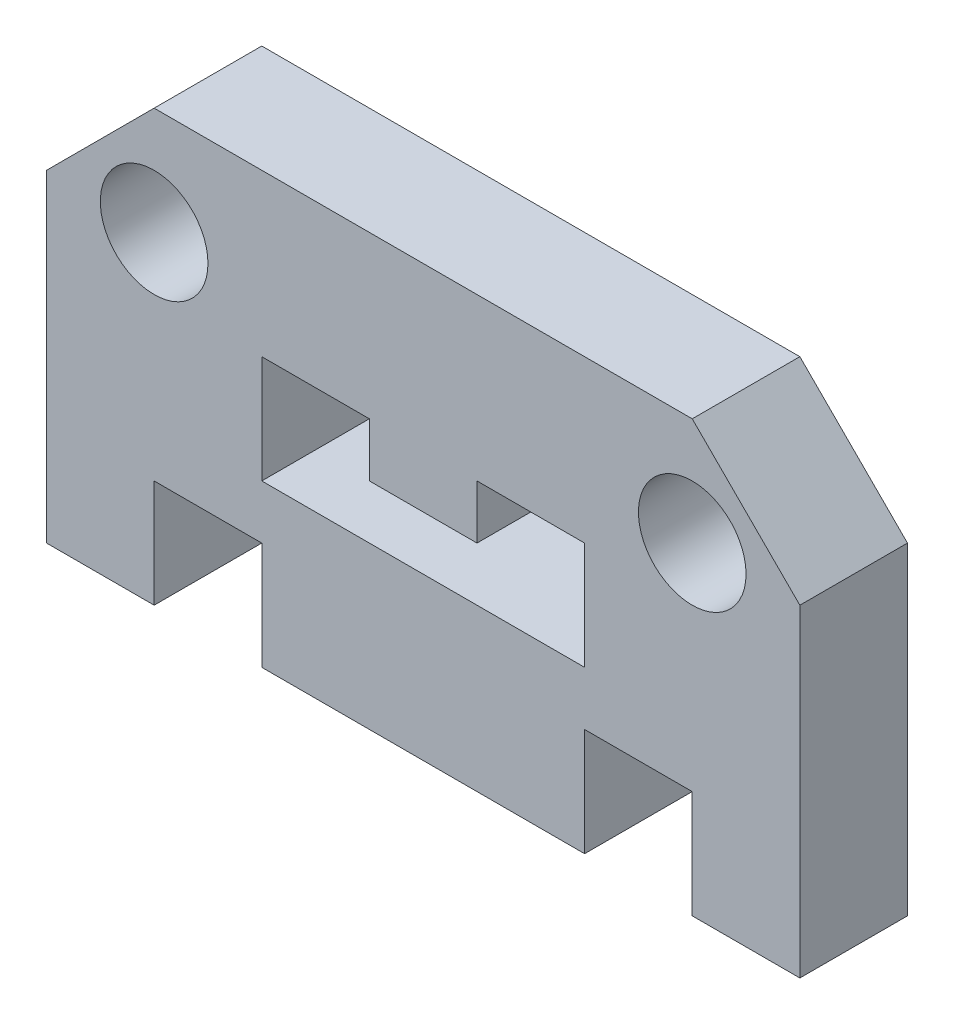
ISO-10303-21;
HEADER;
FILE_DESCRIPTION(('STEP AP214'),'2;1');
FILE_NAME('part.step','',(''),(''),'','','');
FILE_SCHEMA(('AUTOMOTIVE_DESIGN { 1 0 10303 214 1 1 1 1 }'));
ENDSEC;
DATA;
#1=APPLICATION_CONTEXT('core data for automotive mechanical design processes');
#2=APPLICATION_PROTOCOL_DEFINITION('international standard','automotive_design',2000,#1);
#3=PRODUCT_CONTEXT('',#1,'mechanical');
#4=PRODUCT('Part','Part','',(#3));
#5=PRODUCT_RELATED_PRODUCT_CATEGORY('part','',(#4));
#6=PRODUCT_DEFINITION_FORMATION('','',#4);
#7=PRODUCT_DEFINITION_CONTEXT('part definition',#1,'design');
#8=PRODUCT_DEFINITION('design','',#6,#7);
#9=PRODUCT_DEFINITION_SHAPE('','',#8);
#10=(LENGTH_UNIT() NAMED_UNIT(*) SI_UNIT(.MILLI.,.METRE.));
#11=(NAMED_UNIT(*) PLANE_ANGLE_UNIT() SI_UNIT($,.RADIAN.));
#12=(NAMED_UNIT(*) SI_UNIT($,.STERADIAN.) SOLID_ANGLE_UNIT());
#13=UNCERTAINTY_MEASURE_WITH_UNIT(LENGTH_MEASURE(1.E-05),#10,'distance_accuracy_value','');
#14=(GEOMETRIC_REPRESENTATION_CONTEXT(3) GLOBAL_UNCERTAINTY_ASSIGNED_CONTEXT((#13)) GLOBAL_UNIT_ASSIGNED_CONTEXT((#10,
#11,#12)) REPRESENTATION_CONTEXT('',''));
#15=CARTESIAN_POINT('',(0.,0.,0.));
#16=DIRECTION('',(0.,0.,1.));
#17=DIRECTION('',(1.,0.,0.));
#18=AXIS2_PLACEMENT_3D('',#15,#16,#17);
#19=CARTESIAN_POINT('',(0.,0.,10.));
#20=DIRECTION('',(0.,0.,-1.));
#21=DIRECTION('',(-1.,0.,0.));
#22=AXIS2_PLACEMENT_3D('',#19,#20,#21);
#23=PLANE('',#22);
#24=CARTESIAN_POINT('',(25.,30.,10.));
#25=DIRECTION('',(0.,0.,1.));
#26=DIRECTION('',(1.,0.,0.));
#27=AXIS2_PLACEMENT_3D('',#24,#25,#26);
#28=CIRCLE('',#27,5.);
#29=CARTESIAN_POINT('',(30.,30.,10.));
#30=VERTEX_POINT('',#29);
#31=EDGE_CURVE('E251',#30,#30,#28,.T.);
#32=ORIENTED_EDGE('',*,*,#31,.F.);
#33=EDGE_LOOP('',(#32));
#34=FACE_BOUND('',#33,.T.);
#35=CARTESIAN_POINT('',(-25.,30.,10.));
#36=DIRECTION('',(0.,0.,1.));
#37=DIRECTION('',(1.,0.,0.));
#38=AXIS2_PLACEMENT_3D('',#35,#36,#37);
#39=CIRCLE('',#38,5.);
#40=CARTESIAN_POINT('',(-20.,30.,10.));
#41=VERTEX_POINT('',#40);
#42=EDGE_CURVE('E257',#41,#41,#39,.T.);
#43=ORIENTED_EDGE('',*,*,#42,.F.);
#44=EDGE_LOOP('',(#43));
#45=FACE_BOUND('',#44,.T.);
#46=DIRECTION('',(1.,0.,0.));
#47=VECTOR('',#46,1.);
#48=CARTESIAN_POINT('',(25.,0.,10.));
#49=LINE('',#48,#47);
#50=CARTESIAN_POINT('',(25.,0.,10.));
#51=VERTEX_POINT('',#50);
#52=CARTESIAN_POINT('',(35.,0.,10.));
#53=VERTEX_POINT('',#52);
#54=EDGE_CURVE('E263',#51,#53,#49,.T.);
#55=ORIENTED_EDGE('',*,*,#54,.T.);
#56=DIRECTION('',(0.,1.,0.));
#57=VECTOR('',#56,1.);
#58=CARTESIAN_POINT('',(35.,30.,10.));
#59=LINE('',#58,#57);
#60=CARTESIAN_POINT('',(35.,30.,10.));
#61=VERTEX_POINT('',#60);
#62=EDGE_CURVE('E266',#53,#61,#59,.T.);
#63=ORIENTED_EDGE('',*,*,#62,.T.);
#64=DIRECTION('',(-0.707106781186548,0.707106781186547,0.));
#65=VECTOR('',#64,1.);
#66=CARTESIAN_POINT('',(25.,40.,10.));
#67=LINE('',#66,#65);
#68=CARTESIAN_POINT('',(25.,40.,10.));
#69=VERTEX_POINT('',#68);
#70=EDGE_CURVE('E269',#61,#69,#67,.T.);
#71=ORIENTED_EDGE('',*,*,#70,.T.);
#72=DIRECTION('',(-1.,0.,0.));
#73=VECTOR('',#72,1.);
#74=CARTESIAN_POINT('',(-25.,40.,10.));
#75=LINE('',#74,#73);
#76=CARTESIAN_POINT('',(-25.,40.,10.));
#77=VERTEX_POINT('',#76);
#78=EDGE_CURVE('E271',#69,#77,#75,.T.);
#79=ORIENTED_EDGE('',*,*,#78,.T.);
#80=DIRECTION('',(-0.707106781186549,-0.707106781186546,0.));
#81=VECTOR('',#80,1.);
#82=CARTESIAN_POINT('',(-35.,30.,10.));
#83=LINE('',#82,#81);
#84=CARTESIAN_POINT('',(-35.,30.,10.));
#85=VERTEX_POINT('',#84);
#86=EDGE_CURVE('E273',#77,#85,#83,.T.);
#87=ORIENTED_EDGE('',*,*,#86,.T.);
#88=DIRECTION('',(0.,-1.,0.));
#89=VECTOR('',#88,1.);
#90=CARTESIAN_POINT('',(-35.,30.,10.));
#91=LINE('',#90,#89);
#92=CARTESIAN_POINT('',(-35.,0.,10.));
#93=VERTEX_POINT('',#92);
#94=EDGE_CURVE('E275',#85,#93,#91,.T.);
#95=ORIENTED_EDGE('',*,*,#94,.T.);
#96=DIRECTION('',(1.,0.,0.));
#97=VECTOR('',#96,1.);
#98=CARTESIAN_POINT('',(-35.,0.,10.));
#99=LINE('',#98,#97);
#100=CARTESIAN_POINT('',(-25.,0.,10.));
#101=VERTEX_POINT('',#100);
#102=EDGE_CURVE('E277',#93,#101,#99,.T.);
#103=ORIENTED_EDGE('',*,*,#102,.T.);
#104=DIRECTION('',(0.,1.,0.));
#105=VECTOR('',#104,1.);
#106=CARTESIAN_POINT('',(-25.,0.,10.));
#107=LINE('',#106,#105);
#108=CARTESIAN_POINT('',(-25.,10.,10.));
#109=VERTEX_POINT('',#108);
#110=EDGE_CURVE('E279',#101,#109,#107,.T.);
#111=ORIENTED_EDGE('',*,*,#110,.T.);
#112=DIRECTION('',(1.,0.,0.));
#113=VECTOR('',#112,1.);
#114=CARTESIAN_POINT('',(-25.,10.,10.));
#115=LINE('',#114,#113);
#116=CARTESIAN_POINT('',(-15.,10.,10.));
#117=VERTEX_POINT('',#116);
#118=EDGE_CURVE('E281',#109,#117,#115,.T.);
#119=ORIENTED_EDGE('',*,*,#118,.T.);
#120=DIRECTION('',(0.,-1.,0.));
#121=VECTOR('',#120,1.);
#122=CARTESIAN_POINT('',(-15.,10.,10.));
#123=LINE('',#122,#121);
#124=CARTESIAN_POINT('',(-15.,0.,10.));
#125=VERTEX_POINT('',#124);
#126=EDGE_CURVE('E283',#117,#125,#123,.T.);
#127=ORIENTED_EDGE('',*,*,#126,.T.);
#128=DIRECTION('',(1.,0.,0.));
#129=VECTOR('',#128,1.);
#130=CARTESIAN_POINT('',(-15.,0.,10.));
#131=LINE('',#130,#129);
#132=CARTESIAN_POINT('',(15.,0.,10.));
#133=VERTEX_POINT('',#132);
#134=EDGE_CURVE('E285',#125,#133,#131,.T.);
#135=ORIENTED_EDGE('',*,*,#134,.T.);
#136=DIRECTION('',(0.,1.,0.));
#137=VECTOR('',#136,1.);
#138=CARTESIAN_POINT('',(15.,10.,10.));
#139=LINE('',#138,#137);
#140=CARTESIAN_POINT('',(15.,10.,10.));
#141=VERTEX_POINT('',#140);
#142=EDGE_CURVE('E287',#133,#141,#139,.T.);
#143=ORIENTED_EDGE('',*,*,#142,.T.);
#144=DIRECTION('',(1.,0.,0.));
#145=VECTOR('',#144,1.);
#146=CARTESIAN_POINT('',(25.,10.,10.));
#147=LINE('',#146,#145);
#148=CARTESIAN_POINT('',(25.,10.,10.));
#149=VERTEX_POINT('',#148);
#150=EDGE_CURVE('E289',#141,#149,#147,.T.);
#151=ORIENTED_EDGE('',*,*,#150,.T.);
#152=DIRECTION('',(0.,-1.,0.));
#153=VECTOR('',#152,1.);
#154=CARTESIAN_POINT('',(25.,0.,10.));
#155=LINE('',#154,#153);
#156=EDGE_CURVE('E291',#149,#51,#155,.T.);
#157=ORIENTED_EDGE('',*,*,#156,.T.);
#158=EDGE_LOOP('',(#55,#63,#71,#79,#87,#95,#103,#111,#119,#127,#135,#143,#151,#157));
#159=FACE_BOUND('',#158,.T.);
#160=DIRECTION('',(0.,-1.,0.));
#161=VECTOR('',#160,1.);
#162=CARTESIAN_POINT('',(-15.,25.,10.));
#163=LINE('',#162,#161);
#164=CARTESIAN_POINT('',(-15.,25.,10.));
#165=VERTEX_POINT('',#164);
#166=CARTESIAN_POINT('',(-15.,15.,10.));
#167=VERTEX_POINT('',#166);
#168=EDGE_CURVE('E186',#165,#167,#163,.T.);
#169=ORIENTED_EDGE('',*,*,#168,.F.);
#170=DIRECTION('',(-1.,0.,0.));
#171=VECTOR('',#170,1.);
#172=CARTESIAN_POINT('',(-15.,25.,10.));
#173=LINE('',#172,#171);
#174=CARTESIAN_POINT('',(-5.,25.,10.));
#175=VERTEX_POINT('',#174);
#176=EDGE_CURVE('E219',#175,#165,#173,.T.);
#177=ORIENTED_EDGE('',*,*,#176,.F.);
#178=DIRECTION('',(0.,1.,0.));
#179=VECTOR('',#178,1.);
#180=CARTESIAN_POINT('',(-5.,25.,10.));
#181=LINE('',#180,#179);
#182=CARTESIAN_POINT('',(-5.,20.,10.));
#183=VERTEX_POINT('',#182);
#184=EDGE_CURVE('E217',#183,#175,#181,.T.);
#185=ORIENTED_EDGE('',*,*,#184,.F.);
#186=DIRECTION('',(-1.,0.,0.));
#187=VECTOR('',#186,1.);
#188=CARTESIAN_POINT('',(-5.,20.,10.));
#189=LINE('',#188,#187);
#190=CARTESIAN_POINT('',(5.,20.,10.));
#191=VERTEX_POINT('',#190);
#192=EDGE_CURVE('E215',#191,#183,#189,.T.);
#193=ORIENTED_EDGE('',*,*,#192,.F.);
#194=DIRECTION('',(0.,-1.,0.));
#195=VECTOR('',#194,1.);
#196=CARTESIAN_POINT('',(5.,25.,10.));
#197=LINE('',#196,#195);
#198=CARTESIAN_POINT('',(5.,25.,10.));
#199=VERTEX_POINT('',#198);
#200=EDGE_CURVE('E213',#199,#191,#197,.T.);
#201=ORIENTED_EDGE('',*,*,#200,.F.);
#202=DIRECTION('',(-1.,0.,0.));
#203=VECTOR('',#202,1.);
#204=CARTESIAN_POINT('',(15.,25.,10.));
#205=LINE('',#204,#203);
#206=CARTESIAN_POINT('',(15.,25.,10.));
#207=VERTEX_POINT('',#206);
#208=EDGE_CURVE('E209',#207,#199,#205,.T.);
#209=ORIENTED_EDGE('',*,*,#208,.F.);
#210=DIRECTION('',(0.,1.,0.));
#211=VECTOR('',#210,1.);
#212=CARTESIAN_POINT('',(15.,25.,10.));
#213=LINE('',#212,#211);
#214=CARTESIAN_POINT('',(15.,15.,10.));
#215=VERTEX_POINT('',#214);
#216=EDGE_CURVE('E207',#215,#207,#213,.T.);
#217=ORIENTED_EDGE('',*,*,#216,.F.);
#218=DIRECTION('',(1.,0.,0.));
#219=VECTOR('',#218,1.);
#220=CARTESIAN_POINT('',(15.,15.,10.));
#221=LINE('',#220,#219);
#222=EDGE_CURVE('E194',#167,#215,#221,.T.);
#223=ORIENTED_EDGE('',*,*,#222,.F.);
#224=EDGE_LOOP('',(#169,#177,#185,#193,#201,#209,#217,#223));
#225=FACE_BOUND('',#224,.T.);
#226=ADVANCED_FACE('F37',(#34,#45,#159,#225),#23,.F.);
#227=CARTESIAN_POINT('',(0.,0.,0.));
#228=DIRECTION('',(0.,0.,-1.));
#229=DIRECTION('',(-1.,0.,0.));
#230=AXIS2_PLACEMENT_3D('',#227,#228,#229);
#231=PLANE('',#230);
#232=CARTESIAN_POINT('',(-25.,30.,0.));
#233=DIRECTION('',(0.,0.,1.));
#234=DIRECTION('',(1.,0.,0.));
#235=AXIS2_PLACEMENT_3D('',#232,#233,#234);
#236=CIRCLE('',#235,5.);
#237=CARTESIAN_POINT('',(-20.,30.,0.));
#238=VERTEX_POINT('',#237);
#239=EDGE_CURVE('E254',#238,#238,#236,.T.);
#240=ORIENTED_EDGE('',*,*,#239,.T.);
#241=EDGE_LOOP('',(#240));
#242=FACE_BOUND('',#241,.T.);
#243=DIRECTION('',(1.,0.,0.));
#244=VECTOR('',#243,1.);
#245=CARTESIAN_POINT('',(25.,0.,0.));
#246=LINE('',#245,#244);
#247=CARTESIAN_POINT('',(25.,0.,0.));
#248=VERTEX_POINT('',#247);
#249=CARTESIAN_POINT('',(35.,0.,0.));
#250=VERTEX_POINT('',#249);
#251=EDGE_CURVE('E260',#248,#250,#246,.T.);
#252=ORIENTED_EDGE('',*,*,#251,.F.);
#253=DIRECTION('',(0.,-1.,0.));
#254=VECTOR('',#253,1.);
#255=CARTESIAN_POINT('',(25.,0.,0.));
#256=LINE('',#255,#254);
#257=CARTESIAN_POINT('',(25.,10.,0.));
#258=VERTEX_POINT('',#257);
#259=EDGE_CURVE('E267',#258,#248,#256,.T.);
#260=ORIENTED_EDGE('',*,*,#259,.F.);
#261=DIRECTION('',(1.,0.,0.));
#262=VECTOR('',#261,1.);
#263=CARTESIAN_POINT('',(25.,10.,0.));
#264=LINE('',#263,#262);
#265=CARTESIAN_POINT('',(15.,10.,0.));
#266=VERTEX_POINT('',#265);
#267=EDGE_CURVE('E318',#266,#258,#264,.T.);
#268=ORIENTED_EDGE('',*,*,#267,.F.);
#269=DIRECTION('',(0.,1.,0.));
#270=VECTOR('',#269,1.);
#271=CARTESIAN_POINT('',(15.,10.,0.));
#272=LINE('',#271,#270);
#273=CARTESIAN_POINT('',(15.,0.,0.));
#274=VERTEX_POINT('',#273);
#275=EDGE_CURVE('E316',#274,#266,#272,.T.);
#276=ORIENTED_EDGE('',*,*,#275,.F.);
#277=DIRECTION('',(1.,0.,0.));
#278=VECTOR('',#277,1.);
#279=CARTESIAN_POINT('',(-15.,0.,0.));
#280=LINE('',#279,#278);
#281=CARTESIAN_POINT('',(-15.,0.,0.));
#282=VERTEX_POINT('',#281);
#283=EDGE_CURVE('E314',#282,#274,#280,.T.);
#284=ORIENTED_EDGE('',*,*,#283,.F.);
#285=DIRECTION('',(0.,-1.,0.));
#286=VECTOR('',#285,1.);
#287=CARTESIAN_POINT('',(-15.,10.,0.));
#288=LINE('',#287,#286);
#289=CARTESIAN_POINT('',(-15.,10.,0.));
#290=VERTEX_POINT('',#289);
#291=EDGE_CURVE('E312',#290,#282,#288,.T.);
#292=ORIENTED_EDGE('',*,*,#291,.F.);
#293=DIRECTION('',(1.,0.,0.));
#294=VECTOR('',#293,1.);
#295=CARTESIAN_POINT('',(-25.,10.,0.));
#296=LINE('',#295,#294);
#297=CARTESIAN_POINT('',(-25.,10.,0.));
#298=VERTEX_POINT('',#297);
#299=EDGE_CURVE('E310',#298,#290,#296,.T.);
#300=ORIENTED_EDGE('',*,*,#299,.F.);
#301=DIRECTION('',(0.,1.,0.));
#302=VECTOR('',#301,1.);
#303=CARTESIAN_POINT('',(-25.,0.,0.));
#304=LINE('',#303,#302);
#305=CARTESIAN_POINT('',(-25.,0.,0.));
#306=VERTEX_POINT('',#305);
#307=EDGE_CURVE('E308',#306,#298,#304,.T.);
#308=ORIENTED_EDGE('',*,*,#307,.F.);
#309=DIRECTION('',(1.,0.,0.));
#310=VECTOR('',#309,1.);
#311=CARTESIAN_POINT('',(-35.,0.,0.));
#312=LINE('',#311,#310);
#313=CARTESIAN_POINT('',(-35.,0.,0.));
#314=VERTEX_POINT('',#313);
#315=EDGE_CURVE('E306',#314,#306,#312,.T.);
#316=ORIENTED_EDGE('',*,*,#315,.F.);
#317=DIRECTION('',(0.,-1.,0.));
#318=VECTOR('',#317,1.);
#319=CARTESIAN_POINT('',(-35.,30.,0.));
#320=LINE('',#319,#318);
#321=CARTESIAN_POINT('',(-35.,30.,0.));
#322=VERTEX_POINT('',#321);
#323=EDGE_CURVE('E304',#322,#314,#320,.T.);
#324=ORIENTED_EDGE('',*,*,#323,.F.);
#325=DIRECTION('',(-0.707106781186549,-0.707106781186546,0.));
#326=VECTOR('',#325,1.);
#327=CARTESIAN_POINT('',(-35.,30.,0.));
#328=LINE('',#327,#326);
#329=CARTESIAN_POINT('',(-25.,40.,0.));
#330=VERTEX_POINT('',#329);
#331=EDGE_CURVE('E302',#330,#322,#328,.T.);
#332=ORIENTED_EDGE('',*,*,#331,.F.);
#333=DIRECTION('',(-1.,0.,0.));
#334=VECTOR('',#333,1.);
#335=CARTESIAN_POINT('',(-25.,40.,0.));
#336=LINE('',#335,#334);
#337=CARTESIAN_POINT('',(25.,40.,0.));
#338=VERTEX_POINT('',#337);
#339=EDGE_CURVE('E300',#338,#330,#336,.T.);
#340=ORIENTED_EDGE('',*,*,#339,.F.);
#341=DIRECTION('',(-0.707106781186548,0.707106781186547,0.));
#342=VECTOR('',#341,1.);
#343=CARTESIAN_POINT('',(25.,40.,0.));
#344=LINE('',#343,#342);
#345=CARTESIAN_POINT('',(35.,30.,0.));
#346=VERTEX_POINT('',#345);
#347=EDGE_CURVE('E298',#346,#338,#344,.T.);
#348=ORIENTED_EDGE('',*,*,#347,.F.);
#349=DIRECTION('',(0.,1.,0.));
#350=VECTOR('',#349,1.);
#351=CARTESIAN_POINT('',(35.,30.,0.));
#352=LINE('',#351,#350);
#353=EDGE_CURVE('E296',#250,#346,#352,.T.);
#354=ORIENTED_EDGE('',*,*,#353,.F.);
#355=EDGE_LOOP('',(#252,#260,#268,#276,#284,#292,#300,#308,#316,#324,#332,#340,#348,#354));
#356=FACE_BOUND('',#355,.T.);
#357=CARTESIAN_POINT('',(25.,30.,0.));
#358=DIRECTION('',(0.,0.,1.));
#359=DIRECTION('',(1.,0.,0.));
#360=AXIS2_PLACEMENT_3D('',#357,#358,#359);
#361=CIRCLE('',#360,5.);
#362=CARTESIAN_POINT('',(30.,30.,0.));
#363=VERTEX_POINT('',#362);
#364=EDGE_CURVE('E202',#363,#363,#361,.T.);
#365=ORIENTED_EDGE('',*,*,#364,.T.);
#366=EDGE_LOOP('',(#365));
#367=FACE_BOUND('',#366,.T.);
#368=DIRECTION('',(-1.,0.,0.));
#369=VECTOR('',#368,1.);
#370=CARTESIAN_POINT('',(-15.,25.,0.));
#371=LINE('',#370,#369);
#372=CARTESIAN_POINT('',(-5.,25.,0.));
#373=VERTEX_POINT('',#372);
#374=CARTESIAN_POINT('',(-15.,25.,0.));
#375=VERTEX_POINT('',#374);
#376=EDGE_CURVE('E195',#373,#375,#371,.T.);
#377=ORIENTED_EDGE('',*,*,#376,.T.);
#378=DIRECTION('',(0.,-1.,0.));
#379=VECTOR('',#378,1.);
#380=CARTESIAN_POINT('',(-15.,25.,0.));
#381=LINE('',#380,#379);
#382=CARTESIAN_POINT('',(-15.,15.,0.));
#383=VERTEX_POINT('',#382);
#384=EDGE_CURVE('E60',#375,#383,#381,.T.);
#385=ORIENTED_EDGE('',*,*,#384,.T.);
#386=DIRECTION('',(1.,0.,0.));
#387=VECTOR('',#386,1.);
#388=CARTESIAN_POINT('',(15.,15.,0.));
#389=LINE('',#388,#387);
#390=CARTESIAN_POINT('',(15.,15.,0.));
#391=VERTEX_POINT('',#390);
#392=EDGE_CURVE('E201',#383,#391,#389,.T.);
#393=ORIENTED_EDGE('',*,*,#392,.T.);
#394=DIRECTION('',(0.,1.,0.));
#395=VECTOR('',#394,1.);
#396=CARTESIAN_POINT('',(15.,25.,0.));
#397=LINE('',#396,#395);
#398=CARTESIAN_POINT('',(15.,25.,0.));
#399=VERTEX_POINT('',#398);
#400=EDGE_CURVE('E223',#391,#399,#397,.T.);
#401=ORIENTED_EDGE('',*,*,#400,.T.);
#402=DIRECTION('',(-1.,0.,0.));
#403=VECTOR('',#402,1.);
#404=CARTESIAN_POINT('',(15.,25.,0.));
#405=LINE('',#404,#403);
#406=CARTESIAN_POINT('',(5.,25.,0.));
#407=VERTEX_POINT('',#406);
#408=EDGE_CURVE('E226',#399,#407,#405,.T.);
#409=ORIENTED_EDGE('',*,*,#408,.T.);
#410=DIRECTION('',(0.,-1.,0.));
#411=VECTOR('',#410,1.);
#412=CARTESIAN_POINT('',(5.,25.,0.));
#413=LINE('',#412,#411);
#414=CARTESIAN_POINT('',(5.,20.,0.));
#415=VERTEX_POINT('',#414);
#416=EDGE_CURVE('E229',#407,#415,#413,.T.);
#417=ORIENTED_EDGE('',*,*,#416,.T.);
#418=DIRECTION('',(-1.,0.,0.));
#419=VECTOR('',#418,1.);
#420=CARTESIAN_POINT('',(-5.,20.,0.));
#421=LINE('',#420,#419);
#422=CARTESIAN_POINT('',(-5.,20.,0.));
#423=VERTEX_POINT('',#422);
#424=EDGE_CURVE('E232',#415,#423,#421,.T.);
#425=ORIENTED_EDGE('',*,*,#424,.T.);
#426=DIRECTION('',(0.,1.,0.));
#427=VECTOR('',#426,1.);
#428=CARTESIAN_POINT('',(-5.,25.,0.));
#429=LINE('',#428,#427);
#430=EDGE_CURVE('E235',#423,#373,#429,.T.);
#431=ORIENTED_EDGE('',*,*,#430,.T.);
#432=EDGE_LOOP('',(#377,#385,#393,#401,#409,#417,#425,#431));
#433=FACE_BOUND('',#432,.T.);
#434=ADVANCED_FACE('F366',(#242,#356,#367,#433),#231,.T.);
#435=CARTESIAN_POINT('',(25.,0.,10.));
#436=DIRECTION('',(0.,1.,0.));
#437=DIRECTION('',(0.,0.,1.));
#438=AXIS2_PLACEMENT_3D('',#435,#436,#437);
#439=PLANE('',#438);
#440=ORIENTED_EDGE('',*,*,#251,.T.);
#441=DIRECTION('',(0.,0.,-1.));
#442=VECTOR('',#441,1.);
#443=CARTESIAN_POINT('',(35.,0.,10.));
#444=LINE('',#443,#442);
#445=EDGE_CURVE('E11',#53,#250,#444,.T.);
#446=ORIENTED_EDGE('',*,*,#445,.F.);
#447=ORIENTED_EDGE('',*,*,#54,.F.);
#448=DIRECTION('',(0.,0.,-1.));
#449=VECTOR('',#448,1.);
#450=CARTESIAN_POINT('',(25.,0.,10.));
#451=LINE('',#450,#449);
#452=EDGE_CURVE('E293',#51,#248,#451,.T.);
#453=ORIENTED_EDGE('',*,*,#452,.T.);
#454=EDGE_LOOP('',(#440,#446,#447,#453));
#455=FACE_BOUND('',#454,.T.);
#456=ADVANCED_FACE('F39',(#455),#439,.F.);
#457=CARTESIAN_POINT('',(35.,30.,10.));
#458=DIRECTION('',(-1.,0.,0.));
#459=DIRECTION('',(0.,-1.,0.));
#460=AXIS2_PLACEMENT_3D('',#457,#458,#459);
#461=PLANE('',#460);
#462=ORIENTED_EDGE('',*,*,#353,.T.);
#463=DIRECTION('',(0.,0.,-1.));
#464=VECTOR('',#463,1.);
#465=CARTESIAN_POINT('',(35.,30.,10.));
#466=LINE('',#465,#464);
#467=EDGE_CURVE('E45',#61,#346,#466,.T.);
#468=ORIENTED_EDGE('',*,*,#467,.F.);
#469=ORIENTED_EDGE('',*,*,#62,.F.);
#470=ORIENTED_EDGE('',*,*,#445,.T.);
#471=EDGE_LOOP('',(#462,#468,#469,#470));
#472=FACE_BOUND('',#471,.T.);
#473=ADVANCED_FACE('F383',(#472),#461,.F.);
#474=CARTESIAN_POINT('',(25.,40.,10.));
#475=DIRECTION('',(-0.707106781186547,-0.707106781186548,0.));
#476=DIRECTION('',(0.707106781186548,-0.707106781186547,0.));
#477=AXIS2_PLACEMENT_3D('',#474,#475,#476);
#478=PLANE('',#477);
#479=ORIENTED_EDGE('',*,*,#347,.T.);
#480=DIRECTION('',(0.,0.,-1.));
#481=VECTOR('',#480,1.);
#482=CARTESIAN_POINT('',(25.,40.,10.));
#483=LINE('',#482,#481);
#484=EDGE_CURVE('E353',#69,#338,#483,.T.);
#485=ORIENTED_EDGE('',*,*,#484,.F.);
#486=ORIENTED_EDGE('',*,*,#70,.F.);
#487=ORIENTED_EDGE('',*,*,#467,.T.);
#488=EDGE_LOOP('',(#479,#485,#486,#487));
#489=FACE_BOUND('',#488,.T.);
#490=ADVANCED_FACE('F360',(#489),#478,.F.);
#491=CARTESIAN_POINT('',(-25.,40.,10.));
#492=DIRECTION('',(0.,-1.,0.));
#493=DIRECTION('',(0.,0.,-1.));
#494=AXIS2_PLACEMENT_3D('',#491,#492,#493);
#495=PLANE('',#494);
#496=ORIENTED_EDGE('',*,*,#339,.T.);
#497=DIRECTION('',(0.,0.,-1.));
#498=VECTOR('',#497,1.);
#499=CARTESIAN_POINT('',(-25.,40.,10.));
#500=LINE('',#499,#498);
#501=EDGE_CURVE('E350',#77,#330,#500,.T.);
#502=ORIENTED_EDGE('',*,*,#501,.F.);
#503=ORIENTED_EDGE('',*,*,#78,.F.);
#504=ORIENTED_EDGE('',*,*,#484,.T.);
#505=EDGE_LOOP('',(#496,#502,#503,#504));
#506=FACE_BOUND('',#505,.T.);
#507=ADVANCED_FACE('F372',(#506),#495,.F.);
#508=CARTESIAN_POINT('',(-35.,30.,10.));
#509=DIRECTION('',(0.707106781186546,-0.707106781186549,0.));
#510=DIRECTION('',(0.707106781186549,0.707106781186546,0.));
#511=AXIS2_PLACEMENT_3D('',#508,#509,#510);
#512=PLANE('',#511);
#513=ORIENTED_EDGE('',*,*,#331,.T.);
#514=DIRECTION('',(0.,0.,-1.));
#515=VECTOR('',#514,1.);
#516=CARTESIAN_POINT('',(-35.,30.,10.));
#517=LINE('',#516,#515);
#518=EDGE_CURVE('E347',#85,#322,#517,.T.);
#519=ORIENTED_EDGE('',*,*,#518,.F.);
#520=ORIENTED_EDGE('',*,*,#86,.F.);
#521=ORIENTED_EDGE('',*,*,#501,.T.);
#522=EDGE_LOOP('',(#513,#519,#520,#521));
#523=FACE_BOUND('',#522,.T.);
#524=ADVANCED_FACE('F376',(#523),#512,.F.);
#525=CARTESIAN_POINT('',(-35.,30.,10.));
#526=DIRECTION('',(1.,0.,0.));
#527=DIRECTION('',(0.,1.,0.));
#528=AXIS2_PLACEMENT_3D('',#525,#526,#527);
#529=PLANE('',#528);
#530=ORIENTED_EDGE('',*,*,#323,.T.);
#531=DIRECTION('',(0.,0.,-1.));
#532=VECTOR('',#531,1.);
#533=CARTESIAN_POINT('',(-35.,0.,10.));
#534=LINE('',#533,#532);
#535=EDGE_CURVE('E344',#93,#314,#534,.T.);
#536=ORIENTED_EDGE('',*,*,#535,.F.);
#537=ORIENTED_EDGE('',*,*,#94,.F.);
#538=ORIENTED_EDGE('',*,*,#518,.T.);
#539=EDGE_LOOP('',(#530,#536,#537,#538));
#540=FACE_BOUND('',#539,.T.);
#541=ADVANCED_FACE('F426',(#540),#529,.F.);
#542=CARTESIAN_POINT('',(-35.,0.,10.));
#543=DIRECTION('',(0.,1.,0.));
#544=DIRECTION('',(0.,0.,1.));
#545=AXIS2_PLACEMENT_3D('',#542,#543,#544);
#546=PLANE('',#545);
#547=ORIENTED_EDGE('',*,*,#315,.T.);
#548=DIRECTION('',(0.,0.,-1.));
#549=VECTOR('',#548,1.);
#550=CARTESIAN_POINT('',(-25.,0.,10.));
#551=LINE('',#550,#549);
#552=EDGE_CURVE('E341',#101,#306,#551,.T.);
#553=ORIENTED_EDGE('',*,*,#552,.F.);
#554=ORIENTED_EDGE('',*,*,#102,.F.);
#555=ORIENTED_EDGE('',*,*,#535,.T.);
#556=EDGE_LOOP('',(#547,#553,#554,#555));
#557=FACE_BOUND('',#556,.T.);
#558=ADVANCED_FACE('F424',(#557),#546,.F.);
#559=CARTESIAN_POINT('',(-25.,0.,10.));
#560=DIRECTION('',(-1.,0.,0.));
#561=DIRECTION('',(0.,0.,1.));
#562=AXIS2_PLACEMENT_3D('',#559,#560,#561);
#563=PLANE('',#562);
#564=ORIENTED_EDGE('',*,*,#307,.T.);
#565=DIRECTION('',(0.,0.,-1.));
#566=VECTOR('',#565,1.);
#567=CARTESIAN_POINT('',(-25.,10.,10.));
#568=LINE('',#567,#566);
#569=EDGE_CURVE('E338',#109,#298,#568,.T.);
#570=ORIENTED_EDGE('',*,*,#569,.F.);
#571=ORIENTED_EDGE('',*,*,#110,.F.);
#572=ORIENTED_EDGE('',*,*,#552,.T.);
#573=EDGE_LOOP('',(#564,#570,#571,#572));
#574=FACE_BOUND('',#573,.T.);
#575=ADVANCED_FACE('F419',(#574),#563,.F.);
#576=CARTESIAN_POINT('',(-25.,10.,10.));
#577=DIRECTION('',(0.,1.,0.));
#578=DIRECTION('',(0.,0.,1.));
#579=AXIS2_PLACEMENT_3D('',#576,#577,#578);
#580=PLANE('',#579);
#581=ORIENTED_EDGE('',*,*,#299,.T.);
#582=DIRECTION('',(0.,0.,-1.));
#583=VECTOR('',#582,1.);
#584=CARTESIAN_POINT('',(-15.,10.,10.));
#585=LINE('',#584,#583);
#586=EDGE_CURVE('E335',#117,#290,#585,.T.);
#587=ORIENTED_EDGE('',*,*,#586,.F.);
#588=ORIENTED_EDGE('',*,*,#118,.F.);
#589=ORIENTED_EDGE('',*,*,#569,.T.);
#590=EDGE_LOOP('',(#581,#587,#588,#589));
#591=FACE_BOUND('',#590,.T.);
#592=ADVANCED_FACE('F414',(#591),#580,.F.);
#593=CARTESIAN_POINT('',(-15.,10.,10.));
#594=DIRECTION('',(1.,0.,0.));
#595=DIRECTION('',(0.,1.,0.));
#596=AXIS2_PLACEMENT_3D('',#593,#594,#595);
#597=PLANE('',#596);
#598=ORIENTED_EDGE('',*,*,#291,.T.);
#599=DIRECTION('',(0.,0.,-1.));
#600=VECTOR('',#599,1.);
#601=CARTESIAN_POINT('',(-15.,0.,10.));
#602=LINE('',#601,#600);
#603=EDGE_CURVE('E332',#125,#282,#602,.T.);
#604=ORIENTED_EDGE('',*,*,#603,.F.);
#605=ORIENTED_EDGE('',*,*,#126,.F.);
#606=ORIENTED_EDGE('',*,*,#586,.T.);
#607=EDGE_LOOP('',(#598,#604,#605,#606));
#608=FACE_BOUND('',#607,.T.);
#609=ADVANCED_FACE('F410',(#608),#597,.F.);
#610=CARTESIAN_POINT('',(-15.,0.,10.));
#611=DIRECTION('',(0.,1.,0.));
#612=DIRECTION('',(0.,0.,1.));
#613=AXIS2_PLACEMENT_3D('',#610,#611,#612);
#614=PLANE('',#613);
#615=ORIENTED_EDGE('',*,*,#283,.T.);
#616=DIRECTION('',(0.,0.,-1.));
#617=VECTOR('',#616,1.);
#618=CARTESIAN_POINT('',(15.,0.,10.));
#619=LINE('',#618,#617);
#620=EDGE_CURVE('E329',#133,#274,#619,.T.);
#621=ORIENTED_EDGE('',*,*,#620,.F.);
#622=ORIENTED_EDGE('',*,*,#134,.F.);
#623=ORIENTED_EDGE('',*,*,#603,.T.);
#624=EDGE_LOOP('',(#615,#621,#622,#623));
#625=FACE_BOUND('',#624,.T.);
#626=ADVANCED_FACE('F405',(#625),#614,.F.);
#627=CARTESIAN_POINT('',(15.,10.,10.));
#628=DIRECTION('',(-1.,0.,0.));
#629=DIRECTION('',(0.,-1.,0.));
#630=AXIS2_PLACEMENT_3D('',#627,#628,#629);
#631=PLANE('',#630);
#632=ORIENTED_EDGE('',*,*,#275,.T.);
#633=DIRECTION('',(0.,0.,-1.));
#634=VECTOR('',#633,1.);
#635=CARTESIAN_POINT('',(15.,10.,10.));
#636=LINE('',#635,#634);
#637=EDGE_CURVE('E326',#141,#266,#636,.T.);
#638=ORIENTED_EDGE('',*,*,#637,.F.);
#639=ORIENTED_EDGE('',*,*,#142,.F.);
#640=ORIENTED_EDGE('',*,*,#620,.T.);
#641=EDGE_LOOP('',(#632,#638,#639,#640));
#642=FACE_BOUND('',#641,.T.);
#643=ADVANCED_FACE('F399',(#642),#631,.F.);
#644=CARTESIAN_POINT('',(25.,10.,10.));
#645=DIRECTION('',(0.,1.,0.));
#646=DIRECTION('',(0.,0.,1.));
#647=AXIS2_PLACEMENT_3D('',#644,#645,#646);
#648=PLANE('',#647);
#649=ORIENTED_EDGE('',*,*,#267,.T.);
#650=DIRECTION('',(0.,0.,-1.));
#651=VECTOR('',#650,1.);
#652=CARTESIAN_POINT('',(25.,10.,10.));
#653=LINE('',#652,#651);
#654=EDGE_CURVE('E323',#149,#258,#653,.T.);
#655=ORIENTED_EDGE('',*,*,#654,.F.);
#656=ORIENTED_EDGE('',*,*,#150,.F.);
#657=ORIENTED_EDGE('',*,*,#637,.T.);
#658=EDGE_LOOP('',(#649,#655,#656,#657));
#659=FACE_BOUND('',#658,.T.);
#660=ADVANCED_FACE('F395',(#659),#648,.F.);
#661=CARTESIAN_POINT('',(25.,0.,10.));
#662=DIRECTION('',(1.,0.,0.));
#663=DIRECTION('',(0.,0.,-1.));
#664=AXIS2_PLACEMENT_3D('',#661,#662,#663);
#665=PLANE('',#664);
#666=ORIENTED_EDGE('',*,*,#259,.T.);
#667=ORIENTED_EDGE('',*,*,#452,.F.);
#668=ORIENTED_EDGE('',*,*,#156,.F.);
#669=ORIENTED_EDGE('',*,*,#654,.T.);
#670=EDGE_LOOP('',(#666,#667,#668,#669));
#671=FACE_BOUND('',#670,.T.);
#672=ADVANCED_FACE('F390',(#671),#665,.F.);
#673=CARTESIAN_POINT('',(-25.,30.,10.));
#674=DIRECTION('',(0.,0.,-1.));
#675=DIRECTION('',(-1.,0.,0.));
#676=AXIS2_PLACEMENT_3D('',#673,#674,#675);
#677=CYLINDRICAL_SURFACE('',#676,5.);
#678=ORIENTED_EDGE('',*,*,#42,.T.);
#679=EDGE_LOOP('',(#678));
#680=FACE_BOUND('',#679,.T.);
#681=ORIENTED_EDGE('',*,*,#239,.F.);
#682=EDGE_LOOP('',(#681));
#683=FACE_BOUND('',#682,.T.);
#684=ADVANCED_FACE('F446',(#680,#683),#677,.F.);
#685=CARTESIAN_POINT('',(25.,30.,10.));
#686=DIRECTION('',(0.,0.,-1.));
#687=DIRECTION('',(-1.,0.,0.));
#688=AXIS2_PLACEMENT_3D('',#685,#686,#687);
#689=CYLINDRICAL_SURFACE('',#688,5.);
#690=ORIENTED_EDGE('',*,*,#31,.T.);
#691=EDGE_LOOP('',(#690));
#692=FACE_BOUND('',#691,.T.);
#693=ORIENTED_EDGE('',*,*,#364,.F.);
#694=EDGE_LOOP('',(#693));
#695=FACE_BOUND('',#694,.T.);
#696=ADVANCED_FACE('F496',(#692,#695),#689,.F.);
#697=CARTESIAN_POINT('',(-15.,25.,10.));
#698=DIRECTION('',(1.,0.,0.));
#699=DIRECTION('',(0.,0.,-1.));
#700=AXIS2_PLACEMENT_3D('',#697,#698,#699);
#701=PLANE('',#700);
#702=ORIENTED_EDGE('',*,*,#384,.F.);
#703=DIRECTION('',(0.,0.,-1.));
#704=VECTOR('',#703,1.);
#705=CARTESIAN_POINT('',(-15.,25.,10.));
#706=LINE('',#705,#704);
#707=EDGE_CURVE('E190',#165,#375,#706,.T.);
#708=ORIENTED_EDGE('',*,*,#707,.F.);
#709=ORIENTED_EDGE('',*,*,#168,.T.);
#710=DIRECTION('',(0.,0.,-1.));
#711=VECTOR('',#710,1.);
#712=CARTESIAN_POINT('',(-15.,15.,10.));
#713=LINE('',#712,#711);
#714=EDGE_CURVE('E189',#167,#383,#713,.T.);
#715=ORIENTED_EDGE('',*,*,#714,.T.);
#716=EDGE_LOOP('',(#702,#708,#709,#715));
#717=FACE_BOUND('',#716,.T.);
#718=ADVANCED_FACE('F188',(#717),#701,.T.);
#719=CARTESIAN_POINT('',(15.,15.,10.));
#720=DIRECTION('',(0.,1.,0.));
#721=DIRECTION('',(0.,0.,1.));
#722=AXIS2_PLACEMENT_3D('',#719,#720,#721);
#723=PLANE('',#722);
#724=ORIENTED_EDGE('',*,*,#392,.F.);
#725=ORIENTED_EDGE('',*,*,#714,.F.);
#726=ORIENTED_EDGE('',*,*,#222,.T.);
#727=DIRECTION('',(0.,0.,-1.));
#728=VECTOR('',#727,1.);
#729=CARTESIAN_POINT('',(15.,15.,10.));
#730=LINE('',#729,#728);
#731=EDGE_CURVE('E203',#215,#391,#730,.T.);
#732=ORIENTED_EDGE('',*,*,#731,.T.);
#733=EDGE_LOOP('',(#724,#725,#726,#732));
#734=FACE_BOUND('',#733,.T.);
#735=ADVANCED_FACE('F198',(#734),#723,.T.);
#736=CARTESIAN_POINT('',(15.,25.,10.));
#737=DIRECTION('',(-1.,0.,0.));
#738=DIRECTION('',(0.,0.,1.));
#739=AXIS2_PLACEMENT_3D('',#736,#737,#738);
#740=PLANE('',#739);
#741=ORIENTED_EDGE('',*,*,#400,.F.);
#742=ORIENTED_EDGE('',*,*,#731,.F.);
#743=ORIENTED_EDGE('',*,*,#216,.T.);
#744=DIRECTION('',(0.,0.,-1.));
#745=VECTOR('',#744,1.);
#746=CARTESIAN_POINT('',(15.,25.,10.));
#747=LINE('',#746,#745);
#748=EDGE_CURVE('E248',#207,#399,#747,.T.);
#749=ORIENTED_EDGE('',*,*,#748,.T.);
#750=EDGE_LOOP('',(#741,#742,#743,#749));
#751=FACE_BOUND('',#750,.T.);
#752=ADVANCED_FACE('F515',(#751),#740,.T.);
#753=CARTESIAN_POINT('',(15.,25.,10.));
#754=DIRECTION('',(0.,-1.,0.));
#755=DIRECTION('',(1.,0.,0.));
#756=AXIS2_PLACEMENT_3D('',#753,#754,#755);
#757=PLANE('',#756);
#758=ORIENTED_EDGE('',*,*,#408,.F.);
#759=ORIENTED_EDGE('',*,*,#748,.F.);
#760=ORIENTED_EDGE('',*,*,#208,.T.);
#761=DIRECTION('',(0.,0.,-1.));
#762=VECTOR('',#761,1.);
#763=CARTESIAN_POINT('',(5.,25.,10.));
#764=LINE('',#763,#762);
#765=EDGE_CURVE('E246',#199,#407,#764,.T.);
#766=ORIENTED_EDGE('',*,*,#765,.T.);
#767=EDGE_LOOP('',(#758,#759,#760,#766));
#768=FACE_BOUND('',#767,.T.);
#769=ADVANCED_FACE('F522',(#768),#757,.T.);
#770=CARTESIAN_POINT('',(5.,25.,10.));
#771=DIRECTION('',(1.,0.,0.));
#772=DIRECTION('',(0.,1.,0.));
#773=AXIS2_PLACEMENT_3D('',#770,#771,#772);
#774=PLANE('',#773);
#775=ORIENTED_EDGE('',*,*,#416,.F.);
#776=ORIENTED_EDGE('',*,*,#765,.F.);
#777=ORIENTED_EDGE('',*,*,#200,.T.);
#778=DIRECTION('',(0.,0.,-1.));
#779=VECTOR('',#778,1.);
#780=CARTESIAN_POINT('',(5.,20.,10.));
#781=LINE('',#780,#779);
#782=EDGE_CURVE('E244',#191,#415,#781,.T.);
#783=ORIENTED_EDGE('',*,*,#782,.T.);
#784=EDGE_LOOP('',(#775,#776,#777,#783));
#785=FACE_BOUND('',#784,.T.);
#786=ADVANCED_FACE('F530',(#785),#774,.T.);
#787=CARTESIAN_POINT('',(-5.,20.,10.));
#788=DIRECTION('',(0.,-1.,0.));
#789=DIRECTION('',(0.,0.,-1.));
#790=AXIS2_PLACEMENT_3D('',#787,#788,#789);
#791=PLANE('',#790);
#792=ORIENTED_EDGE('',*,*,#424,.F.);
#793=ORIENTED_EDGE('',*,*,#782,.F.);
#794=ORIENTED_EDGE('',*,*,#192,.T.);
#795=DIRECTION('',(0.,0.,-1.));
#796=VECTOR('',#795,1.);
#797=CARTESIAN_POINT('',(-5.,20.,10.));
#798=LINE('',#797,#796);
#799=EDGE_CURVE('E242',#183,#423,#798,.T.);
#800=ORIENTED_EDGE('',*,*,#799,.T.);
#801=EDGE_LOOP('',(#792,#793,#794,#800));
#802=FACE_BOUND('',#801,.T.);
#803=ADVANCED_FACE('F538',(#802),#791,.T.);
#804=CARTESIAN_POINT('',(-5.,25.,10.));
#805=DIRECTION('',(-1.,0.,0.));
#806=DIRECTION('',(0.,-1.,0.));
#807=AXIS2_PLACEMENT_3D('',#804,#805,#806);
#808=PLANE('',#807);
#809=ORIENTED_EDGE('',*,*,#430,.F.);
#810=ORIENTED_EDGE('',*,*,#799,.F.);
#811=ORIENTED_EDGE('',*,*,#184,.T.);
#812=DIRECTION('',(0.,0.,-1.));
#813=VECTOR('',#812,1.);
#814=CARTESIAN_POINT('',(-5.,25.,10.));
#815=LINE('',#814,#813);
#816=EDGE_CURVE('E52',#175,#373,#815,.T.);
#817=ORIENTED_EDGE('',*,*,#816,.T.);
#818=EDGE_LOOP('',(#809,#810,#811,#817));
#819=FACE_BOUND('',#818,.T.);
#820=ADVANCED_FACE('F546',(#819),#808,.T.);
#821=CARTESIAN_POINT('',(-15.,25.,10.));
#822=DIRECTION('',(0.,-1.,0.));
#823=DIRECTION('',(1.,0.,0.));
#824=AXIS2_PLACEMENT_3D('',#821,#822,#823);
#825=PLANE('',#824);
#826=ORIENTED_EDGE('',*,*,#376,.F.);
#827=ORIENTED_EDGE('',*,*,#816,.F.);
#828=ORIENTED_EDGE('',*,*,#176,.T.);
#829=ORIENTED_EDGE('',*,*,#707,.T.);
#830=EDGE_LOOP('',(#826,#827,#828,#829));
#831=FACE_BOUND('',#830,.T.);
#832=ADVANCED_FACE('F554',(#831),#825,.T.);
#833=CLOSED_SHELL('',(#226,#434,#456,#473,#490,#507,#524,#541,#558,#575,#592,#609,#626,#643,
#660,#672,#684,#696,#718,#735,#752,#769,#786,#803,#820,#832));
#834=MANIFOLD_SOLID_BREP('B2',#833);
#835=ADVANCED_BREP_SHAPE_REPRESENTATION('',(#18,#834),#14);
#836=SHAPE_DEFINITION_REPRESENTATION(#9,#835);
ENDSEC;
END-ISO-10303-21;
